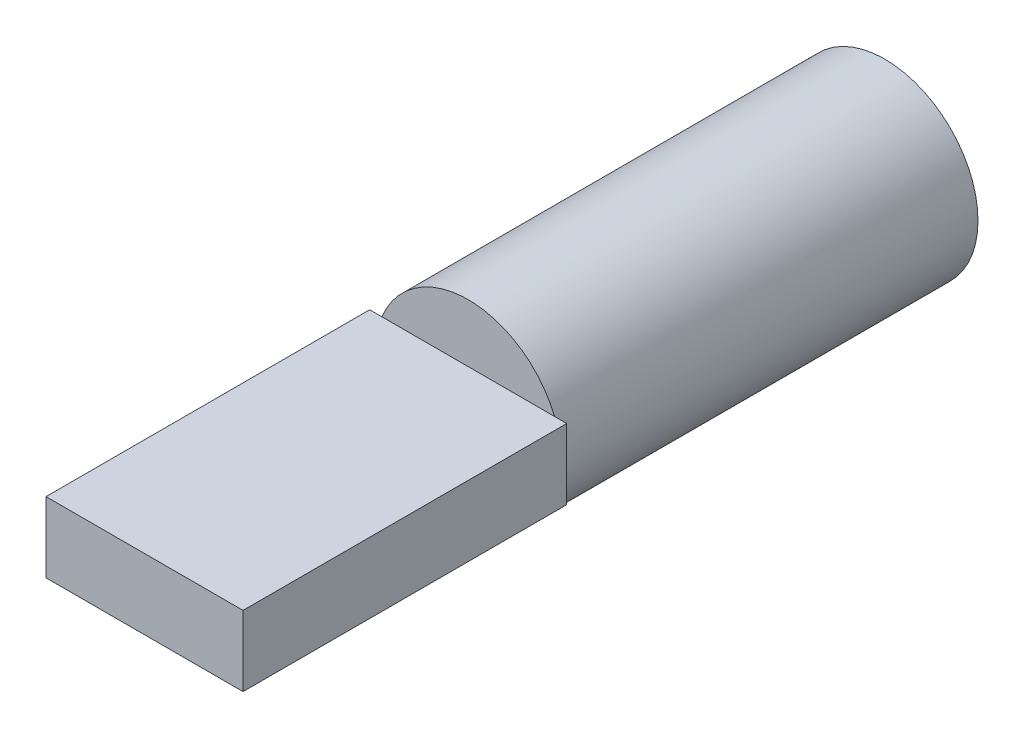
ISO-10303-21;
HEADER;
FILE_DESCRIPTION(('STEP AP214'),'2;1');
FILE_NAME('part.step','',(''),(''),'','','');
FILE_SCHEMA(('AUTOMOTIVE_DESIGN { 1 0 10303 214 1 1 1 1 }'));
ENDSEC;
DATA;
#1=APPLICATION_CONTEXT('core data for automotive mechanical design processes');
#2=APPLICATION_PROTOCOL_DEFINITION('international standard','automotive_design',2000,#1);
#3=PRODUCT_CONTEXT('',#1,'mechanical');
#4=PRODUCT('Part','Part','',(#3));
#5=PRODUCT_RELATED_PRODUCT_CATEGORY('part','',(#4));
#6=PRODUCT_DEFINITION_FORMATION('','',#4);
#7=PRODUCT_DEFINITION_CONTEXT('part definition',#1,'design');
#8=PRODUCT_DEFINITION('design','',#6,#7);
#9=PRODUCT_DEFINITION_SHAPE('','',#8);
#10=(LENGTH_UNIT() NAMED_UNIT(*) SI_UNIT(.MILLI.,.METRE.));
#11=(NAMED_UNIT(*) PLANE_ANGLE_UNIT() SI_UNIT($,.RADIAN.));
#12=(NAMED_UNIT(*) SI_UNIT($,.STERADIAN.) SOLID_ANGLE_UNIT());
#13=UNCERTAINTY_MEASURE_WITH_UNIT(LENGTH_MEASURE(1.E-05),#10,'distance_accuracy_value','');
#14=(GEOMETRIC_REPRESENTATION_CONTEXT(3) GLOBAL_UNCERTAINTY_ASSIGNED_CONTEXT((#13)) GLOBAL_UNIT_ASSIGNED_CONTEXT((#10,
#11,#12)) REPRESENTATION_CONTEXT('',''));
#15=CARTESIAN_POINT('',(0.,0.,0.));
#16=DIRECTION('',(0.,0.,1.));
#17=DIRECTION('',(1.,0.,0.));
#18=AXIS2_PLACEMENT_3D('',#15,#16,#17);
#19=CARTESIAN_POINT('',(0.,0.,29.6));
#20=DIRECTION('',(0.,0.,1.));
#21=DIRECTION('',(1.,0.,0.));
#22=AXIS2_PLACEMENT_3D('',#19,#20,#21);
#23=PLANE('',#22);
#24=DIRECTION('',(1.,0.,0.));
#25=VECTOR('',#24,1.);
#26=CARTESIAN_POINT('',(-7.,-2.5,29.6));
#27=LINE('',#26,#25);
#28=CARTESIAN_POINT('',(-6.13519559590401,-2.5,29.6));
#29=VERTEX_POINT('',#28);
#30=CARTESIAN_POINT('',(6.13519559590401,-2.5,29.6));
#31=VERTEX_POINT('',#30);
#32=EDGE_CURVE('E11',#29,#31,#27,.T.);
#33=ORIENTED_EDGE('',*,*,#32,.F.);
#34=CARTESIAN_POINT('',(0.,0.,29.6));
#35=DIRECTION('',(0.,0.,1.));
#36=DIRECTION('',(1.,0.,0.));
#37=AXIS2_PLACEMENT_3D('',#34,#35,#36);
#38=CIRCLE('',#37,6.625);
#39=EDGE_CURVE('E143',#29,#31,#38,.T.);
#40=ORIENTED_EDGE('',*,*,#39,.T.);
#41=EDGE_LOOP('',(#33,#40));
#42=FACE_BOUND('',#41,.T.);
#43=ADVANCED_FACE('F39',(#42),#23,.T.);
#44=CARTESIAN_POINT('',(0.,0.,29.6));
#45=DIRECTION('',(0.,0.,-1.));
#46=DIRECTION('',(-1.,0.,0.));
#47=AXIS2_PLACEMENT_3D('',#44,#45,#46);
#48=CYLINDRICAL_SURFACE('',#47,6.625);
#49=CARTESIAN_POINT('',(6.13519559590401,2.5,29.6));
#50=VERTEX_POINT('',#49);
#51=CARTESIAN_POINT('',(-6.13519559590401,2.5,29.6));
#52=VERTEX_POINT('',#51);
#53=EDGE_CURVE('E131',#50,#52,#38,.T.);
#54=ORIENTED_EDGE('',*,*,#53,.F.);
#55=EDGE_CURVE('E59',#31,#50,#38,.T.);
#56=ORIENTED_EDGE('',*,*,#55,.F.);
#57=ORIENTED_EDGE('',*,*,#39,.F.);
#58=EDGE_CURVE('E133',#52,#29,#38,.T.);
#59=ORIENTED_EDGE('',*,*,#58,.F.);
#60=EDGE_LOOP('',(#54,#56,#57,#59));
#61=FACE_BOUND('',#60,.T.);
#62=CARTESIAN_POINT('',(0.,0.,0.));
#63=DIRECTION('',(0.,0.,1.));
#64=DIRECTION('',(1.,0.,0.));
#65=AXIS2_PLACEMENT_3D('',#62,#63,#64);
#66=CIRCLE('',#65,6.625);
#67=CARTESIAN_POINT('',(6.625,0.,0.));
#68=VERTEX_POINT('',#67);
#69=EDGE_CURVE('E43',#68,#68,#66,.T.);
#70=ORIENTED_EDGE('',*,*,#69,.T.);
#71=EDGE_LOOP('',(#70));
#72=FACE_BOUND('',#71,.T.);
#73=ADVANCED_FACE('F41',(#61,#72),#48,.T.);
#74=DIRECTION('',(-1.,0.,0.));
#75=VECTOR('',#74,1.);
#76=CARTESIAN_POINT('',(-7.,2.5,29.6));
#77=LINE('',#76,#75);
#78=EDGE_CURVE('E49',#50,#52,#77,.T.);
#79=ORIENTED_EDGE('',*,*,#78,.F.);
#80=ORIENTED_EDGE('',*,*,#53,.T.);
#81=EDGE_LOOP('',(#79,#80));
#82=FACE_BOUND('',#81,.T.);
#83=ADVANCED_FACE('F186',(#82),#23,.T.);
#84=CARTESIAN_POINT('',(0.,0.,0.));
#85=DIRECTION('',(0.,0.,1.));
#86=DIRECTION('',(1.,0.,0.));
#87=AXIS2_PLACEMENT_3D('',#84,#85,#86);
#88=PLANE('',#87);
#89=ORIENTED_EDGE('',*,*,#69,.F.);
#90=EDGE_LOOP('',(#89));
#91=FACE_BOUND('',#90,.T.);
#92=ADVANCED_FACE('F179',(#91),#88,.F.);
#93=CARTESIAN_POINT('',(0.,0.,29.6));
#94=DIRECTION('',(0.,0.,-1.));
#95=DIRECTION('',(-1.,0.,0.));
#96=AXIS2_PLACEMENT_3D('',#93,#94,#95);
#97=PLANE('',#96);
#98=CARTESIAN_POINT('',(-7.,2.5,29.6));
#99=VERTEX_POINT('',#98);
#100=EDGE_CURVE('E141',#52,#99,#77,.T.);
#101=ORIENTED_EDGE('',*,*,#100,.F.);
#102=ORIENTED_EDGE('',*,*,#58,.T.);
#103=CARTESIAN_POINT('',(-7.,-2.5,29.6));
#104=VERTEX_POINT('',#103);
#105=EDGE_CURVE('E51',#104,#29,#27,.T.);
#106=ORIENTED_EDGE('',*,*,#105,.F.);
#107=DIRECTION('',(0.,-1.,0.));
#108=VECTOR('',#107,1.);
#109=CARTESIAN_POINT('',(-7.,-2.5,29.6));
#110=LINE('',#109,#108);
#111=EDGE_CURVE('E151',#99,#104,#110,.T.);
#112=ORIENTED_EDGE('',*,*,#111,.F.);
#113=EDGE_LOOP('',(#101,#102,#106,#112));
#114=FACE_BOUND('',#113,.T.);
#115=ADVANCED_FACE('F177',(#114),#97,.T.);
#116=CARTESIAN_POINT('',(7.,-2.5,52.6));
#117=DIRECTION('',(-1.,0.,0.));
#118=DIRECTION('',(0.,0.,1.));
#119=AXIS2_PLACEMENT_3D('',#116,#117,#118);
#120=PLANE('',#119);
#121=DIRECTION('',(0.,1.,0.));
#122=VECTOR('',#121,1.);
#123=CARTESIAN_POINT('',(7.,-2.5,29.6));
#124=LINE('',#123,#122);
#125=CARTESIAN_POINT('',(7.,-2.5,29.6));
#126=VERTEX_POINT('',#125);
#127=CARTESIAN_POINT('',(7.,2.5,29.6));
#128=VERTEX_POINT('',#127);
#129=EDGE_CURVE('E122',#126,#128,#124,.T.);
#130=ORIENTED_EDGE('',*,*,#129,.T.);
#131=DIRECTION('',(0.,0.,-1.));
#132=VECTOR('',#131,1.);
#133=CARTESIAN_POINT('',(7.,2.5,52.6));
#134=LINE('',#133,#132);
#135=CARTESIAN_POINT('',(7.,2.5,52.6));
#136=VERTEX_POINT('',#135);
#137=EDGE_CURVE('E101',#136,#128,#134,.T.);
#138=ORIENTED_EDGE('',*,*,#137,.F.);
#139=DIRECTION('',(0.,1.,0.));
#140=VECTOR('',#139,1.);
#141=CARTESIAN_POINT('',(7.,-2.5,52.6));
#142=LINE('',#141,#140);
#143=CARTESIAN_POINT('',(7.,-2.5,52.6));
#144=VERTEX_POINT('',#143);
#145=EDGE_CURVE('E109',#144,#136,#142,.T.);
#146=ORIENTED_EDGE('',*,*,#145,.F.);
#147=DIRECTION('',(0.,0.,-1.));
#148=VECTOR('',#147,1.);
#149=CARTESIAN_POINT('',(7.,-2.5,52.6));
#150=LINE('',#149,#148);
#151=EDGE_CURVE('E162',#144,#126,#150,.T.);
#152=ORIENTED_EDGE('',*,*,#151,.T.);
#153=EDGE_LOOP('',(#130,#138,#146,#152));
#154=FACE_BOUND('',#153,.T.);
#155=ADVANCED_FACE('F120',(#154),#120,.F.);
#156=CARTESIAN_POINT('',(-7.,2.5,52.6));
#157=DIRECTION('',(0.,-1.,0.));
#158=DIRECTION('',(0.,0.,-1.));
#159=AXIS2_PLACEMENT_3D('',#156,#157,#158);
#160=PLANE('',#159);
#161=EDGE_CURVE('E140',#128,#50,#77,.T.);
#162=ORIENTED_EDGE('',*,*,#161,.T.);
#163=ORIENTED_EDGE('',*,*,#78,.T.);
#164=ORIENTED_EDGE('',*,*,#100,.T.);
#165=DIRECTION('',(0.,0.,-1.));
#166=VECTOR('',#165,1.);
#167=CARTESIAN_POINT('',(-7.,2.5,52.6));
#168=LINE('',#167,#166);
#169=CARTESIAN_POINT('',(-7.,2.5,52.6));
#170=VERTEX_POINT('',#169);
#171=EDGE_CURVE('E104',#170,#99,#168,.T.);
#172=ORIENTED_EDGE('',*,*,#171,.F.);
#173=DIRECTION('',(-1.,0.,0.));
#174=VECTOR('',#173,1.);
#175=CARTESIAN_POINT('',(-7.,2.5,52.6));
#176=LINE('',#175,#174);
#177=EDGE_CURVE('E96',#136,#170,#176,.T.);
#178=ORIENTED_EDGE('',*,*,#177,.F.);
#179=ORIENTED_EDGE('',*,*,#137,.T.);
#180=EDGE_LOOP('',(#162,#163,#164,#172,#178,#179));
#181=FACE_BOUND('',#180,.T.);
#182=ADVANCED_FACE('F99',(#181),#160,.F.);
#183=CARTESIAN_POINT('',(-7.,-2.5,52.6));
#184=DIRECTION('',(1.,0.,0.));
#185=DIRECTION('',(0.,0.,-1.));
#186=AXIS2_PLACEMENT_3D('',#183,#184,#185);
#187=PLANE('',#186);
#188=ORIENTED_EDGE('',*,*,#111,.T.);
#189=DIRECTION('',(0.,0.,-1.));
#190=VECTOR('',#189,1.);
#191=CARTESIAN_POINT('',(-7.,-2.5,52.6));
#192=LINE('',#191,#190);
#193=CARTESIAN_POINT('',(-7.,-2.5,52.6));
#194=VERTEX_POINT('',#193);
#195=EDGE_CURVE('E128',#194,#104,#192,.T.);
#196=ORIENTED_EDGE('',*,*,#195,.F.);
#197=DIRECTION('',(0.,-1.,0.));
#198=VECTOR('',#197,1.);
#199=CARTESIAN_POINT('',(-7.,-2.5,52.6));
#200=LINE('',#199,#198);
#201=EDGE_CURVE('E108',#170,#194,#200,.T.);
#202=ORIENTED_EDGE('',*,*,#201,.F.);
#203=ORIENTED_EDGE('',*,*,#171,.T.);
#204=EDGE_LOOP('',(#188,#196,#202,#203));
#205=FACE_BOUND('',#204,.T.);
#206=ADVANCED_FACE('F176',(#205),#187,.F.);
#207=CARTESIAN_POINT('',(-7.,-2.5,52.6));
#208=DIRECTION('',(0.,1.,0.));
#209=DIRECTION('',(0.,0.,1.));
#210=AXIS2_PLACEMENT_3D('',#207,#208,#209);
#211=PLANE('',#210);
#212=ORIENTED_EDGE('',*,*,#105,.T.);
#213=ORIENTED_EDGE('',*,*,#32,.T.);
#214=EDGE_CURVE('E52',#31,#126,#27,.T.);
#215=ORIENTED_EDGE('',*,*,#214,.T.);
#216=ORIENTED_EDGE('',*,*,#151,.F.);
#217=DIRECTION('',(1.,0.,0.));
#218=VECTOR('',#217,1.);
#219=CARTESIAN_POINT('',(-7.,-2.5,52.6));
#220=LINE('',#219,#218);
#221=EDGE_CURVE('E114',#194,#144,#220,.T.);
#222=ORIENTED_EDGE('',*,*,#221,.F.);
#223=ORIENTED_EDGE('',*,*,#195,.T.);
#224=EDGE_LOOP('',(#212,#213,#215,#216,#222,#223));
#225=FACE_BOUND('',#224,.T.);
#226=ADVANCED_FACE('F153',(#225),#211,.F.);
#227=CARTESIAN_POINT('',(0.,0.,52.6));
#228=DIRECTION('',(0.,0.,-1.));
#229=DIRECTION('',(-1.,0.,0.));
#230=AXIS2_PLACEMENT_3D('',#227,#228,#229);
#231=PLANE('',#230);
#232=ORIENTED_EDGE('',*,*,#145,.T.);
#233=ORIENTED_EDGE('',*,*,#177,.T.);
#234=ORIENTED_EDGE('',*,*,#201,.T.);
#235=ORIENTED_EDGE('',*,*,#221,.T.);
#236=EDGE_LOOP('',(#232,#233,#234,#235));
#237=FACE_BOUND('',#236,.T.);
#238=ADVANCED_FACE('F112',(#237),#231,.F.);
#239=ORIENTED_EDGE('',*,*,#214,.F.);
#240=ORIENTED_EDGE('',*,*,#55,.T.);
#241=ORIENTED_EDGE('',*,*,#161,.F.);
#242=ORIENTED_EDGE('',*,*,#129,.F.);
#243=EDGE_LOOP('',(#239,#240,#241,#242));
#244=FACE_BOUND('',#243,.T.);
#245=ADVANCED_FACE('F148',(#244),#97,.T.);
#246=CLOSED_SHELL('',(#43,#73,#83,#92,#115,#155,#182,#206,#226,#238,#245));
#247=MANIFOLD_SOLID_BREP('B2',#246);
#248=ADVANCED_BREP_SHAPE_REPRESENTATION('',(#18,#247),#14);
#249=SHAPE_DEFINITION_REPRESENTATION(#9,#248);
ENDSEC;
END-ISO-10303-21;
